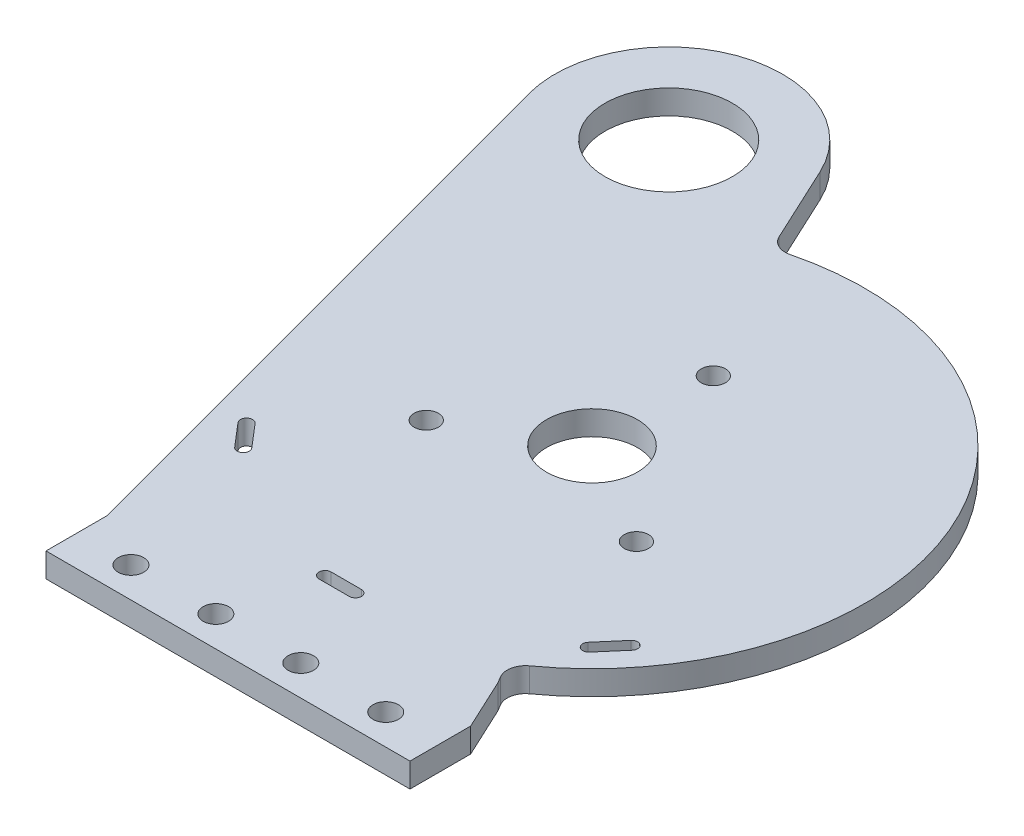
ISO-10303-21;
HEADER;
FILE_DESCRIPTION(('STEP AP214'),'2;1');
FILE_NAME('part.step','',(''),(''),'','','');
FILE_SCHEMA(('AUTOMOTIVE_DESIGN { 1 0 10303 214 1 1 1 1 }'));
ENDSEC;
DATA;
#1=APPLICATION_CONTEXT('core data for automotive mechanical design processes');
#2=APPLICATION_PROTOCOL_DEFINITION('international standard','automotive_design',2000,#1);
#3=PRODUCT_CONTEXT('',#1,'mechanical');
#4=PRODUCT('Part','Part','',(#3));
#5=PRODUCT_RELATED_PRODUCT_CATEGORY('part','',(#4));
#6=PRODUCT_DEFINITION_FORMATION('','',#4);
#7=PRODUCT_DEFINITION_CONTEXT('part definition',#1,'design');
#8=PRODUCT_DEFINITION('design','',#6,#7);
#9=PRODUCT_DEFINITION_SHAPE('','',#8);
#10=(LENGTH_UNIT() NAMED_UNIT(*) SI_UNIT(.MILLI.,.METRE.));
#11=(NAMED_UNIT(*) PLANE_ANGLE_UNIT() SI_UNIT($,.RADIAN.));
#12=(NAMED_UNIT(*) SI_UNIT($,.STERADIAN.) SOLID_ANGLE_UNIT());
#13=UNCERTAINTY_MEASURE_WITH_UNIT(LENGTH_MEASURE(1.E-05),#10,'distance_accuracy_value','');
#14=(GEOMETRIC_REPRESENTATION_CONTEXT(3) GLOBAL_UNCERTAINTY_ASSIGNED_CONTEXT((#13)) GLOBAL_UNIT_ASSIGNED_CONTEXT((#10,
#11,#12)) REPRESENTATION_CONTEXT('',''));
#15=CARTESIAN_POINT('',(0.,0.,0.));
#16=DIRECTION('',(0.,0.,1.));
#17=DIRECTION('',(1.,0.,0.));
#18=AXIS2_PLACEMENT_3D('',#15,#16,#17);
#19=CARTESIAN_POINT('',(-7.35232150739505,4.,-110.));
#20=DIRECTION('',(0.,-1.,0.));
#21=DIRECTION('',(0.,0.,-1.));
#22=AXIS2_PLACEMENT_3D('',#19,#20,#21);
#23=PLANE('',#22);
#24=CARTESIAN_POINT('',(-1.73526570816673,4.,-34.7933954997494));
#25=DIRECTION('',(0.,1.,0.));
#26=DIRECTION('',(0.,0.,1.));
#27=AXIS2_PLACEMENT_3D('',#24,#25,#26);
#28=CIRCLE('',#27,0.999999999999993);
#29=CARTESIAN_POINT('',(-0.975772037280662,4.,-35.4439101912699));
#30=VERTEX_POINT('',#29);
#31=CARTESIAN_POINT('',(-2.4947593790528,4.,-34.1428808082289));
#32=VERTEX_POINT('',#31);
#33=EDGE_CURVE('E226',#30,#32,#28,.T.);
#34=ORIENTED_EDGE('',*,*,#33,.F.);
#35=DIRECTION('',(-0.650514691520488,0.,-0.759493670886074));
#36=VECTOR('',#35,1.);
#37=CARTESIAN_POINT('',(-0.975772037280662,4.,-35.4439101912699));
#38=LINE('',#37,#36);
#39=CARTESIAN_POINT('',(2.27680142032179,4.,-31.6464418368395));
#40=VERTEX_POINT('',#39);
#41=EDGE_CURVE('E234',#40,#30,#38,.T.);
#42=ORIENTED_EDGE('',*,*,#41,.F.);
#43=CARTESIAN_POINT('',(1.51730774943569,4.,-30.995927145319));
#44=DIRECTION('',(0.,1.,0.));
#45=DIRECTION('',(0.,0.,1.));
#46=AXIS2_PLACEMENT_3D('',#43,#44,#45);
#47=CIRCLE('',#46,1.);
#48=CARTESIAN_POINT('',(0.757814078549616,4.,-30.3454124537985));
#49=VERTEX_POINT('',#48);
#50=EDGE_CURVE('E231',#49,#40,#47,.T.);
#51=ORIENTED_EDGE('',*,*,#50,.F.);
#52=DIRECTION('',(0.650514691520485,0.,0.759493670886077));
#53=VECTOR('',#52,1.);
#54=CARTESIAN_POINT('',(-2.4947593790528,4.,-34.1428808082289));
#55=LINE('',#54,#53);
#56=EDGE_CURVE('E228',#32,#49,#55,.T.);
#57=ORIENTED_EDGE('',*,*,#56,.F.);
#58=EDGE_LOOP('',(#34,#42,#51,#57));
#59=FACE_BOUND('',#58,.T.);
#60=CARTESIAN_POINT('',(51.,4.,-5.));
#61=DIRECTION('',(0.,1.,0.));
#62=DIRECTION('',(0.,0.,-1.));
#63=AXIS2_PLACEMENT_3D('',#60,#61,#62);
#64=CIRCLE('',#63,2.1);
#65=CARTESIAN_POINT('',(51.,4.,-7.1));
#66=VERTEX_POINT('',#65);
#67=EDGE_CURVE('E288',#66,#66,#64,.T.);
#68=ORIENTED_EDGE('',*,*,#67,.F.);
#69=EDGE_LOOP('',(#68));
#70=FACE_BOUND('',#69,.T.);
#71=CARTESIAN_POINT('',(37.,4.,-5.));
#72=DIRECTION('',(0.,1.,0.));
#73=DIRECTION('',(0.,0.,-1.));
#74=AXIS2_PLACEMENT_3D('',#71,#72,#73);
#75=CIRCLE('',#74,2.1);
#76=CARTESIAN_POINT('',(37.,4.,-7.1));
#77=VERTEX_POINT('',#76);
#78=EDGE_CURVE('E294',#77,#77,#75,.T.);
#79=ORIENTED_EDGE('',*,*,#78,.F.);
#80=EDGE_LOOP('',(#79));
#81=FACE_BOUND('',#80,.T.);
#82=CARTESIAN_POINT('',(9.,4.,-5.));
#83=DIRECTION('',(0.,1.,0.));
#84=DIRECTION('',(0.,0.,1.));
#85=AXIS2_PLACEMENT_3D('',#82,#83,#84);
#86=CIRCLE('',#85,2.1);
#87=CARTESIAN_POINT('',(9.,4.,-2.9));
#88=VERTEX_POINT('',#87);
#89=EDGE_CURVE('E300',#88,#88,#86,.T.);
#90=ORIENTED_EDGE('',*,*,#89,.F.);
#91=EDGE_LOOP('',(#90));
#92=FACE_BOUND('',#91,.T.);
#93=CARTESIAN_POINT('',(23.,4.,-5.));
#94=DIRECTION('',(0.,1.,0.));
#95=DIRECTION('',(0.,0.,1.));
#96=AXIS2_PLACEMENT_3D('',#93,#94,#95);
#97=CIRCLE('',#96,2.1);
#98=CARTESIAN_POINT('',(23.,4.,-2.9));
#99=VERTEX_POINT('',#98);
#100=EDGE_CURVE('E306',#99,#99,#97,.T.);
#101=ORIENTED_EDGE('',*,*,#100,.F.);
#102=EDGE_LOOP('',(#101));
#103=FACE_BOUND('',#102,.T.);
#104=CARTESIAN_POINT('',(12.6794919243111,4.,-50.0000000000002));
#105=DIRECTION('',(0.,1.,0.));
#106=DIRECTION('',(0.,0.,1.));
#107=AXIS2_PLACEMENT_3D('',#104,#105,#106);
#108=CIRCLE('',#107,2.00000000000001);
#109=CARTESIAN_POINT('',(12.6794919243111,4.,-48.0000000000001));
#110=VERTEX_POINT('',#109);
#111=EDGE_CURVE('E312',#110,#110,#108,.T.);
#112=ORIENTED_EDGE('',*,*,#111,.F.);
#113=EDGE_LOOP('',(#112));
#114=FACE_BOUND('',#113,.T.);
#115=CARTESIAN_POINT('',(47.3205080756887,4.,-49.9999999999999));
#116=DIRECTION('',(0.,1.,0.));
#117=DIRECTION('',(0.,0.,1.));
#118=AXIS2_PLACEMENT_3D('',#115,#116,#117);
#119=CIRCLE('',#118,2.00000000000001);
#120=CARTESIAN_POINT('',(47.3205080756887,4.,-47.9999999999999));
#121=VERTEX_POINT('',#120);
#122=EDGE_CURVE('E318',#121,#121,#119,.T.);
#123=ORIENTED_EDGE('',*,*,#122,.F.);
#124=EDGE_LOOP('',(#123));
#125=FACE_BOUND('',#124,.T.);
#126=CARTESIAN_POINT('',(30.,4.,-80.));
#127=DIRECTION('',(0.,1.,0.));
#128=DIRECTION('',(0.,0.,1.));
#129=AXIS2_PLACEMENT_3D('',#126,#127,#128);
#130=CIRCLE('',#129,2.);
#131=CARTESIAN_POINT('',(30.,4.,-78.));
#132=VERTEX_POINT('',#131);
#133=EDGE_CURVE('E324',#132,#132,#130,.T.);
#134=ORIENTED_EDGE('',*,*,#133,.F.);
#135=EDGE_LOOP('',(#134));
#136=FACE_BOUND('',#135,.T.);
#137=CARTESIAN_POINT('',(30.,4.,-60.));
#138=DIRECTION('',(0.,1.,0.));
#139=DIRECTION('',(0.,0.,1.));
#140=AXIS2_PLACEMENT_3D('',#137,#138,#139);
#141=CIRCLE('',#140,7.5);
#142=CARTESIAN_POINT('',(30.,4.,-52.5));
#143=VERTEX_POINT('',#142);
#144=EDGE_CURVE('E330',#143,#143,#141,.T.);
#145=ORIENTED_EDGE('',*,*,#144,.F.);
#146=EDGE_LOOP('',(#145));
#147=FACE_BOUND('',#146,.T.);
#148=CARTESIAN_POINT('',(-7.35232150739505,4.,-110.));
#149=DIRECTION('',(0.,1.,0.));
#150=DIRECTION('',(0.,0.,1.));
#151=AXIS2_PLACEMENT_3D('',#148,#149,#150);
#152=CIRCLE('',#151,10.5);
#153=CARTESIAN_POINT('',(-7.35232150739505,4.,-99.5));
#154=VERTEX_POINT('',#153);
#155=EDGE_CURVE('E336',#154,#154,#152,.T.);
#156=ORIENTED_EDGE('',*,*,#155,.F.);
#157=EDGE_LOOP('',(#156));
#158=FACE_BOUND('',#157,.T.);
#159=DIRECTION('',(0.258819045102515,0.,0.96592582628907));
#160=VECTOR('',#159,1.);
#161=CARTESIAN_POINT('',(0.,4.,-10.));
#162=LINE('',#161,#160);
#163=CARTESIAN_POINT('',(-25.4925121525996,4.,-105.139350566071));
#164=VERTEX_POINT('',#163);
#165=CARTESIAN_POINT('',(0.,4.,-10.));
#166=VERTEX_POINT('',#165);
#167=EDGE_CURVE('E342',#164,#166,#162,.T.);
#168=ORIENTED_EDGE('',*,*,#167,.T.);
#169=DIRECTION('',(0.,0.,1.));
#170=VECTOR('',#169,1.);
#171=CARTESIAN_POINT('',(0.,4.,-10.));
#172=LINE('',#171,#170);
#173=CARTESIAN_POINT('',(0.,4.,0.));
#174=VERTEX_POINT('',#173);
#175=EDGE_CURVE('E345',#166,#174,#172,.T.);
#176=ORIENTED_EDGE('',*,*,#175,.T.);
#177=DIRECTION('',(1.,0.,0.));
#178=VECTOR('',#177,1.);
#179=CARTESIAN_POINT('',(0.,4.,0.));
#180=LINE('',#179,#178);
#181=CARTESIAN_POINT('',(60.,4.,0.));
#182=VERTEX_POINT('',#181);
#183=EDGE_CURVE('E348',#174,#182,#180,.T.);
#184=ORIENTED_EDGE('',*,*,#183,.T.);
#185=DIRECTION('',(0.,0.,-1.));
#186=VECTOR('',#185,1.);
#187=CARTESIAN_POINT('',(60.,4.,0.));
#188=LINE('',#187,#186);
#189=CARTESIAN_POINT('',(60.,4.,-10.));
#190=VERTEX_POINT('',#189);
#191=EDGE_CURVE('E350',#182,#190,#188,.T.);
#192=ORIENTED_EDGE('',*,*,#191,.T.);
#193=DIRECTION('',(-0.422618261740704,0.,-0.906307787036648));
#194=VECTOR('',#193,1.);
#195=CARTESIAN_POINT('',(56.09518228465,4.,-18.3739086138962));
#196=LINE('',#195,#194);
#197=CARTESIAN_POINT('',(56.09518228465,4.,-18.3739086138962));
#198=VERTEX_POINT('',#197);
#199=EDGE_CURVE('E352',#190,#198,#196,.T.);
#200=ORIENTED_EDGE('',*,*,#199,.T.);
#201=DIRECTION('',(-0.50794355475064,0.,-0.861390355870835));
#202=VECTOR('',#201,1.);
#203=CARTESIAN_POINT('',(55.4311501675812,4.,-19.5));
#204=LINE('',#203,#202);
#205=CARTESIAN_POINT('',(55.4311501675812,4.,-19.5));
#206=VERTEX_POINT('',#205);
#207=EDGE_CURVE('E354',#198,#206,#204,.T.);
#208=ORIENTED_EDGE('',*,*,#207,.T.);
#209=CARTESIAN_POINT('',(58.0153212351937,4.,-21.0238306642519));
#210=DIRECTION('',(0.,-1.,0.));
#211=DIRECTION('',(0.,0.,-1.));
#212=AXIS2_PLACEMENT_3D('',#209,#210,#211);
#213=CIRCLE('',#212,3.);
#214=CARTESIAN_POINT('',(56.264363657994,4.,-23.4598412477362));
#215=VERTEX_POINT('',#214);
#216=EDGE_CURVE('E356',#206,#215,#213,.T.);
#217=ORIENTED_EDGE('',*,*,#216,.T.);
#218=CARTESIAN_POINT('',(30.,4.,-60.));
#219=DIRECTION('',(0.,1.,0.));
#220=DIRECTION('',(0.,0.,-1.));
#221=AXIS2_PLACEMENT_3D('',#218,#219,#220);
#222=CIRCLE('',#221,45.);
#223=CARTESIAN_POINT('',(19.0204171989288,4.,-103.639990393152));
#224=VERTEX_POINT('',#223);
#225=EDGE_CURVE('E358',#215,#224,#222,.T.);
#226=ORIENTED_EDGE('',*,*,#225,.T.);
#227=CARTESIAN_POINT('',(18.2884450121907,4.,-106.549323086029));
#228=DIRECTION('',(0.,-1.,0.));
#229=DIRECTION('',(0.,0.,1.));
#230=AXIS2_PLACEMENT_3D('',#227,#228,#229);
#231=CIRCLE('',#230,3.00000000000001);
#232=CARTESIAN_POINT('',(15.5695216510808,4.,-105.281468300807));
#233=VERTEX_POINT('',#232);
#234=EDGE_CURVE('E360',#224,#233,#231,.T.);
#235=ORIENTED_EDGE('',*,*,#234,.T.);
#236=DIRECTION('',(-0.422618261740701,0.,-0.906307787036649));
#237=VECTOR('',#236,1.);
#238=CARTESIAN_POINT('',(9.66823596464226,4.,-117.936816295278));
#239=LINE('',#238,#237);
#240=CARTESIAN_POINT('',(9.66823596464226,4.,-117.936816295278));
#241=VERTEX_POINT('',#240);
#242=EDGE_CURVE('E362',#233,#241,#239,.T.);
#243=ORIENTED_EDGE('',*,*,#242,.T.);
#244=CARTESIAN_POINT('',(-7.35232150739505,4.,-110.));
#245=DIRECTION('',(0.,1.,0.));
#246=DIRECTION('',(0.,0.,-1.));
#247=AXIS2_PLACEMENT_3D('',#244,#245,#246);
#248=CIRCLE('',#247,18.780107283078);
#249=EDGE_CURVE('E364',#241,#164,#248,.T.);
#250=ORIENTED_EDGE('',*,*,#249,.T.);
#251=EDGE_LOOP('',(#168,#176,#184,#192,#200,#208,#217,#226,#235,#243,#250));
#252=FACE_BOUND('',#251,.T.);
#253=CARTESIAN_POINT('',(26.5,4.,-19.5));
#254=DIRECTION('',(0.,1.,0.));
#255=DIRECTION('',(0.,0.,1.));
#256=AXIS2_PLACEMENT_3D('',#253,#254,#255);
#257=CIRCLE('',#256,1.);
#258=CARTESIAN_POINT('',(26.5,4.,-20.5));
#259=VERTEX_POINT('',#258);
#260=CARTESIAN_POINT('',(26.5,4.,-18.5));
#261=VERTEX_POINT('',#260);
#262=EDGE_CURVE('E257',#259,#261,#257,.T.);
#263=ORIENTED_EDGE('',*,*,#262,.F.);
#264=DIRECTION('',(-1.,0.,0.));
#265=VECTOR('',#264,1.);
#266=CARTESIAN_POINT('',(26.5,4.,-20.5));
#267=LINE('',#266,#265);
#268=CARTESIAN_POINT('',(31.5,4.,-20.5));
#269=VERTEX_POINT('',#268);
#270=EDGE_CURVE('E265',#269,#259,#267,.T.);
#271=ORIENTED_EDGE('',*,*,#270,.F.);
#272=CARTESIAN_POINT('',(31.5,4.,-19.5));
#273=DIRECTION('',(0.,1.,0.));
#274=DIRECTION('',(0.,0.,1.));
#275=AXIS2_PLACEMENT_3D('',#272,#273,#274);
#276=CIRCLE('',#275,1.);
#277=CARTESIAN_POINT('',(31.5,4.,-18.5));
#278=VERTEX_POINT('',#277);
#279=EDGE_CURVE('E262',#278,#269,#276,.T.);
#280=ORIENTED_EDGE('',*,*,#279,.F.);
#281=DIRECTION('',(1.,0.,0.));
#282=VECTOR('',#281,1.);
#283=CARTESIAN_POINT('',(26.5,4.,-18.5));
#284=LINE('',#283,#282);
#285=EDGE_CURVE('E259',#261,#278,#284,.T.);
#286=ORIENTED_EDGE('',*,*,#285,.F.);
#287=EDGE_LOOP('',(#263,#271,#280,#286));
#288=FACE_BOUND('',#287,.T.);
#289=CARTESIAN_POINT('',(61.7352657081667,4.,-34.7933954997494));
#290=DIRECTION('',(0.,1.,0.));
#291=DIRECTION('',(0.,0.,-1.));
#292=AXIS2_PLACEMENT_3D('',#289,#290,#291);
#293=CIRCLE('',#292,0.999999999999994);
#294=CARTESIAN_POINT('',(62.4947593790528,4.,-34.1428808082289));
#295=VERTEX_POINT('',#294);
#296=CARTESIAN_POINT('',(60.9757720372807,4.,-35.4439101912699));
#297=VERTEX_POINT('',#296);
#298=EDGE_CURVE('E190',#295,#297,#293,.T.);
#299=ORIENTED_EDGE('',*,*,#298,.F.);
#300=DIRECTION('',(0.650514691520485,0.,-0.759493670886077));
#301=VECTOR('',#300,1.);
#302=CARTESIAN_POINT('',(62.4947593790528,4.,-34.1428808082289));
#303=LINE('',#302,#301);
#304=CARTESIAN_POINT('',(59.2421859214504,4.,-30.3454124537985));
#305=VERTEX_POINT('',#304);
#306=EDGE_CURVE('E212',#305,#295,#303,.T.);
#307=ORIENTED_EDGE('',*,*,#306,.F.);
#308=CARTESIAN_POINT('',(58.4826922505643,4.,-30.995927145319));
#309=DIRECTION('',(0.,1.,0.));
#310=DIRECTION('',(0.,0.,-1.));
#311=AXIS2_PLACEMENT_3D('',#308,#309,#310);
#312=CIRCLE('',#311,1.);
#313=CARTESIAN_POINT('',(57.7231985796782,4.,-31.6464418368395));
#314=VERTEX_POINT('',#313);
#315=EDGE_CURVE('E210',#314,#305,#312,.T.);
#316=ORIENTED_EDGE('',*,*,#315,.F.);
#317=DIRECTION('',(-0.650514691520487,0.,0.759493670886075));
#318=VECTOR('',#317,1.);
#319=CARTESIAN_POINT('',(60.9757720372807,4.,-35.4439101912699));
#320=LINE('',#319,#318);
#321=EDGE_CURVE('E198',#297,#314,#320,.T.);
#322=ORIENTED_EDGE('',*,*,#321,.F.);
#323=EDGE_LOOP('',(#299,#307,#316,#322));
#324=FACE_BOUND('',#323,.T.);
#325=ADVANCED_FACE('F35',(#59,#70,#81,#92,#103,#114,#125,#136,#147,#158,#252,#288,#324),#23,.F.);
#326=CARTESIAN_POINT('',(-7.35232150739505,0.,-110.));
#327=DIRECTION('',(0.,-1.,0.));
#328=DIRECTION('',(0.,0.,-1.));
#329=AXIS2_PLACEMENT_3D('',#326,#327,#328);
#330=PLANE('',#329);
#331=CARTESIAN_POINT('',(37.,0.,-5.));
#332=DIRECTION('',(0.,1.,0.));
#333=DIRECTION('',(0.,0.,-1.));
#334=AXIS2_PLACEMENT_3D('',#331,#332,#333);
#335=CIRCLE('',#334,2.1);
#336=CARTESIAN_POINT('',(37.,0.,-7.1));
#337=VERTEX_POINT('',#336);
#338=EDGE_CURVE('E291',#337,#337,#335,.T.);
#339=ORIENTED_EDGE('',*,*,#338,.T.);
#340=EDGE_LOOP('',(#339));
#341=FACE_BOUND('',#340,.T.);
#342=CARTESIAN_POINT('',(23.,0.,-5.));
#343=DIRECTION('',(0.,1.,0.));
#344=DIRECTION('',(0.,0.,1.));
#345=AXIS2_PLACEMENT_3D('',#342,#343,#344);
#346=CIRCLE('',#345,2.1);
#347=CARTESIAN_POINT('',(23.,0.,-2.9));
#348=VERTEX_POINT('',#347);
#349=EDGE_CURVE('E303',#348,#348,#346,.T.);
#350=ORIENTED_EDGE('',*,*,#349,.T.);
#351=EDGE_LOOP('',(#350));
#352=FACE_BOUND('',#351,.T.);
#353=CARTESIAN_POINT('',(47.3205080756887,0.,-49.9999999999999));
#354=DIRECTION('',(0.,1.,0.));
#355=DIRECTION('',(0.,0.,1.));
#356=AXIS2_PLACEMENT_3D('',#353,#354,#355);
#357=CIRCLE('',#356,2.00000000000001);
#358=CARTESIAN_POINT('',(47.3205080756887,0.,-47.9999999999999));
#359=VERTEX_POINT('',#358);
#360=EDGE_CURVE('E315',#359,#359,#357,.T.);
#361=ORIENTED_EDGE('',*,*,#360,.T.);
#362=EDGE_LOOP('',(#361));
#363=FACE_BOUND('',#362,.T.);
#364=CARTESIAN_POINT('',(30.,0.,-60.));
#365=DIRECTION('',(0.,1.,0.));
#366=DIRECTION('',(0.,0.,1.));
#367=AXIS2_PLACEMENT_3D('',#364,#365,#366);
#368=CIRCLE('',#367,7.5);
#369=CARTESIAN_POINT('',(30.,0.,-52.5));
#370=VERTEX_POINT('',#369);
#371=EDGE_CURVE('E327',#370,#370,#368,.T.);
#372=ORIENTED_EDGE('',*,*,#371,.T.);
#373=EDGE_LOOP('',(#372));
#374=FACE_BOUND('',#373,.T.);
#375=DIRECTION('',(0.258819045102515,0.,0.96592582628907));
#376=VECTOR('',#375,1.);
#377=CARTESIAN_POINT('',(0.,0.,-10.));
#378=LINE('',#377,#376);
#379=CARTESIAN_POINT('',(-25.4925121525996,0.,-105.139350566071));
#380=VERTEX_POINT('',#379);
#381=CARTESIAN_POINT('',(0.,0.,-10.));
#382=VERTEX_POINT('',#381);
#383=EDGE_CURVE('E339',#380,#382,#378,.T.);
#384=ORIENTED_EDGE('',*,*,#383,.F.);
#385=CARTESIAN_POINT('',(-7.35232150739505,0.,-110.));
#386=DIRECTION('',(0.,1.,0.));
#387=DIRECTION('',(0.,0.,-1.));
#388=AXIS2_PLACEMENT_3D('',#385,#386,#387);
#389=CIRCLE('',#388,18.780107283078);
#390=CARTESIAN_POINT('',(9.66823596464226,0.,-117.936816295278));
#391=VERTEX_POINT('',#390);
#392=EDGE_CURVE('E346',#391,#380,#389,.T.);
#393=ORIENTED_EDGE('',*,*,#392,.F.);
#394=DIRECTION('',(-0.422618261740701,0.,-0.906307787036649));
#395=VECTOR('',#394,1.);
#396=CARTESIAN_POINT('',(9.66823596464226,0.,-117.936816295278));
#397=LINE('',#396,#395);
#398=CARTESIAN_POINT('',(15.5695216510808,0.,-105.281468300807));
#399=VERTEX_POINT('',#398);
#400=EDGE_CURVE('E385',#399,#391,#397,.T.);
#401=ORIENTED_EDGE('',*,*,#400,.F.);
#402=CARTESIAN_POINT('',(18.2884450121907,0.,-106.549323086029));
#403=DIRECTION('',(0.,-1.,0.));
#404=DIRECTION('',(0.,0.,1.));
#405=AXIS2_PLACEMENT_3D('',#402,#403,#404);
#406=CIRCLE('',#405,3.00000000000001);
#407=CARTESIAN_POINT('',(19.0204171989288,0.,-103.639990393152));
#408=VERTEX_POINT('',#407);
#409=EDGE_CURVE('E383',#408,#399,#406,.T.);
#410=ORIENTED_EDGE('',*,*,#409,.F.);
#411=CARTESIAN_POINT('',(30.,0.,-60.));
#412=DIRECTION('',(0.,1.,0.));
#413=DIRECTION('',(0.,0.,-1.));
#414=AXIS2_PLACEMENT_3D('',#411,#412,#413);
#415=CIRCLE('',#414,45.);
#416=CARTESIAN_POINT('',(56.264363657994,0.,-23.4598412477362));
#417=VERTEX_POINT('',#416);
#418=EDGE_CURVE('E381',#417,#408,#415,.T.);
#419=ORIENTED_EDGE('',*,*,#418,.F.);
#420=CARTESIAN_POINT('',(58.0153212351937,0.,-21.0238306642519));
#421=DIRECTION('',(0.,-1.,0.));
#422=DIRECTION('',(0.,0.,-1.));
#423=AXIS2_PLACEMENT_3D('',#420,#421,#422);
#424=CIRCLE('',#423,3.);
#425=CARTESIAN_POINT('',(55.4311501675812,0.,-19.5));
#426=VERTEX_POINT('',#425);
#427=EDGE_CURVE('E379',#426,#417,#424,.T.);
#428=ORIENTED_EDGE('',*,*,#427,.F.);
#429=DIRECTION('',(-0.50794355475064,0.,-0.861390355870835));
#430=VECTOR('',#429,1.);
#431=CARTESIAN_POINT('',(55.4311501675812,0.,-19.5));
#432=LINE('',#431,#430);
#433=CARTESIAN_POINT('',(56.09518228465,0.,-18.3739086138962));
#434=VERTEX_POINT('',#433);
#435=EDGE_CURVE('E377',#434,#426,#432,.T.);
#436=ORIENTED_EDGE('',*,*,#435,.F.);
#437=DIRECTION('',(-0.422618261740704,0.,-0.906307787036648));
#438=VECTOR('',#437,1.);
#439=CARTESIAN_POINT('',(56.09518228465,0.,-18.3739086138962));
#440=LINE('',#439,#438);
#441=CARTESIAN_POINT('',(60.,0.,-10.));
#442=VERTEX_POINT('',#441);
#443=EDGE_CURVE('E375',#442,#434,#440,.T.);
#444=ORIENTED_EDGE('',*,*,#443,.F.);
#445=DIRECTION('',(0.,0.,-1.));
#446=VECTOR('',#445,1.);
#447=CARTESIAN_POINT('',(60.,0.,0.));
#448=LINE('',#447,#446);
#449=CARTESIAN_POINT('',(60.,0.,0.));
#450=VERTEX_POINT('',#449);
#451=EDGE_CURVE('E373',#450,#442,#448,.T.);
#452=ORIENTED_EDGE('',*,*,#451,.F.);
#453=DIRECTION('',(1.,0.,0.));
#454=VECTOR('',#453,1.);
#455=CARTESIAN_POINT('',(0.,0.,0.));
#456=LINE('',#455,#454);
#457=CARTESIAN_POINT('',(0.,0.,0.));
#458=VERTEX_POINT('',#457);
#459=EDGE_CURVE('E371',#458,#450,#456,.T.);
#460=ORIENTED_EDGE('',*,*,#459,.F.);
#461=DIRECTION('',(0.,0.,1.));
#462=VECTOR('',#461,1.);
#463=CARTESIAN_POINT('',(0.,0.,-10.));
#464=LINE('',#463,#462);
#465=EDGE_CURVE('E369',#382,#458,#464,.T.);
#466=ORIENTED_EDGE('',*,*,#465,.F.);
#467=EDGE_LOOP('',(#384,#393,#401,#410,#419,#428,#436,#444,#452,#460,#466));
#468=FACE_BOUND('',#467,.T.);
#469=CARTESIAN_POINT('',(-7.35232150739505,0.,-110.));
#470=DIRECTION('',(0.,1.,0.));
#471=DIRECTION('',(0.,0.,1.));
#472=AXIS2_PLACEMENT_3D('',#469,#470,#471);
#473=CIRCLE('',#472,10.5);
#474=CARTESIAN_POINT('',(-7.35232150739505,0.,-99.5));
#475=VERTEX_POINT('',#474);
#476=EDGE_CURVE('E333',#475,#475,#473,.T.);
#477=ORIENTED_EDGE('',*,*,#476,.T.);
#478=EDGE_LOOP('',(#477));
#479=FACE_BOUND('',#478,.T.);
#480=CARTESIAN_POINT('',(30.,0.,-80.));
#481=DIRECTION('',(0.,1.,0.));
#482=DIRECTION('',(0.,0.,1.));
#483=AXIS2_PLACEMENT_3D('',#480,#481,#482);
#484=CIRCLE('',#483,2.);
#485=CARTESIAN_POINT('',(30.,0.,-78.));
#486=VERTEX_POINT('',#485);
#487=EDGE_CURVE('E321',#486,#486,#484,.T.);
#488=ORIENTED_EDGE('',*,*,#487,.T.);
#489=EDGE_LOOP('',(#488));
#490=FACE_BOUND('',#489,.T.);
#491=CARTESIAN_POINT('',(12.6794919243111,0.,-50.0000000000002));
#492=DIRECTION('',(0.,1.,0.));
#493=DIRECTION('',(0.,0.,1.));
#494=AXIS2_PLACEMENT_3D('',#491,#492,#493);
#495=CIRCLE('',#494,2.00000000000001);
#496=CARTESIAN_POINT('',(12.6794919243111,0.,-48.0000000000001));
#497=VERTEX_POINT('',#496);
#498=EDGE_CURVE('E309',#497,#497,#495,.T.);
#499=ORIENTED_EDGE('',*,*,#498,.T.);
#500=EDGE_LOOP('',(#499));
#501=FACE_BOUND('',#500,.T.);
#502=CARTESIAN_POINT('',(9.,0.,-5.));
#503=DIRECTION('',(0.,1.,0.));
#504=DIRECTION('',(0.,0.,1.));
#505=AXIS2_PLACEMENT_3D('',#502,#503,#504);
#506=CIRCLE('',#505,2.1);
#507=CARTESIAN_POINT('',(9.,0.,-2.9));
#508=VERTEX_POINT('',#507);
#509=EDGE_CURVE('E297',#508,#508,#506,.T.);
#510=ORIENTED_EDGE('',*,*,#509,.T.);
#511=EDGE_LOOP('',(#510));
#512=FACE_BOUND('',#511,.T.);
#513=CARTESIAN_POINT('',(51.,0.,-5.));
#514=DIRECTION('',(0.,1.,0.));
#515=DIRECTION('',(0.,0.,-1.));
#516=AXIS2_PLACEMENT_3D('',#513,#514,#515);
#517=CIRCLE('',#516,2.1);
#518=CARTESIAN_POINT('',(51.,0.,-7.1));
#519=VERTEX_POINT('',#518);
#520=EDGE_CURVE('E287',#519,#519,#517,.T.);
#521=ORIENTED_EDGE('',*,*,#520,.T.);
#522=EDGE_LOOP('',(#521));
#523=FACE_BOUND('',#522,.T.);
#524=DIRECTION('',(-1.,0.,0.));
#525=VECTOR('',#524,1.);
#526=CARTESIAN_POINT('',(26.5,0.,-20.5));
#527=LINE('',#526,#525);
#528=CARTESIAN_POINT('',(31.5,0.,-20.5));
#529=VERTEX_POINT('',#528);
#530=CARTESIAN_POINT('',(26.5,0.,-20.5));
#531=VERTEX_POINT('',#530);
#532=EDGE_CURVE('E260',#529,#531,#527,.T.);
#533=ORIENTED_EDGE('',*,*,#532,.T.);
#534=CARTESIAN_POINT('',(26.5,0.,-19.5));
#535=DIRECTION('',(0.,1.,0.));
#536=DIRECTION('',(0.,0.,1.));
#537=AXIS2_PLACEMENT_3D('',#534,#535,#536);
#538=CIRCLE('',#537,1.);
#539=CARTESIAN_POINT('',(26.5,0.,-18.5));
#540=VERTEX_POINT('',#539);
#541=EDGE_CURVE('E256',#531,#540,#538,.T.);
#542=ORIENTED_EDGE('',*,*,#541,.T.);
#543=DIRECTION('',(1.,0.,0.));
#544=VECTOR('',#543,1.);
#545=CARTESIAN_POINT('',(26.5,0.,-18.5));
#546=LINE('',#545,#544);
#547=CARTESIAN_POINT('',(31.5,0.,-18.5));
#548=VERTEX_POINT('',#547);
#549=EDGE_CURVE('E270',#540,#548,#546,.T.);
#550=ORIENTED_EDGE('',*,*,#549,.T.);
#551=CARTESIAN_POINT('',(31.5,0.,-19.5));
#552=DIRECTION('',(0.,1.,0.));
#553=DIRECTION('',(0.,0.,1.));
#554=AXIS2_PLACEMENT_3D('',#551,#552,#553);
#555=CIRCLE('',#554,1.);
#556=EDGE_CURVE('E273',#548,#529,#555,.T.);
#557=ORIENTED_EDGE('',*,*,#556,.T.);
#558=EDGE_LOOP('',(#533,#542,#550,#557));
#559=FACE_BOUND('',#558,.T.);
#560=DIRECTION('',(-0.650514691520488,0.,-0.759493670886074));
#561=VECTOR('',#560,1.);
#562=CARTESIAN_POINT('',(-0.975772037280662,0.,-35.4439101912699));
#563=LINE('',#562,#561);
#564=CARTESIAN_POINT('',(2.27680142032178,0.,-31.6464418368395));
#565=VERTEX_POINT('',#564);
#566=CARTESIAN_POINT('',(-0.975772037280658,0.,-35.4439101912699));
#567=VERTEX_POINT('',#566);
#568=EDGE_CURVE('E229',#565,#567,#563,.T.);
#569=ORIENTED_EDGE('',*,*,#568,.T.);
#570=CARTESIAN_POINT('',(-1.73526570816673,0.,-34.7933954997494));
#571=DIRECTION('',(0.,1.,0.));
#572=DIRECTION('',(0.,0.,1.));
#573=AXIS2_PLACEMENT_3D('',#570,#571,#572);
#574=CIRCLE('',#573,0.999999999999993);
#575=CARTESIAN_POINT('',(-2.4947593790528,0.,-34.1428808082289));
#576=VERTEX_POINT('',#575);
#577=EDGE_CURVE('E206',#567,#576,#574,.T.);
#578=ORIENTED_EDGE('',*,*,#577,.T.);
#579=DIRECTION('',(0.650514691520485,0.,0.759493670886077));
#580=VECTOR('',#579,1.);
#581=CARTESIAN_POINT('',(-2.4947593790528,0.,-34.1428808082289));
#582=LINE('',#581,#580);
#583=CARTESIAN_POINT('',(0.757814078549616,0.,-30.3454124537985));
#584=VERTEX_POINT('',#583);
#585=EDGE_CURVE('E239',#576,#584,#582,.T.);
#586=ORIENTED_EDGE('',*,*,#585,.T.);
#587=CARTESIAN_POINT('',(1.51730774943569,0.,-30.995927145319));
#588=DIRECTION('',(0.,1.,0.));
#589=DIRECTION('',(0.,0.,1.));
#590=AXIS2_PLACEMENT_3D('',#587,#588,#589);
#591=CIRCLE('',#590,1.);
#592=EDGE_CURVE('E242',#584,#565,#591,.T.);
#593=ORIENTED_EDGE('',*,*,#592,.T.);
#594=EDGE_LOOP('',(#569,#578,#586,#593));
#595=FACE_BOUND('',#594,.T.);
#596=DIRECTION('',(0.650514691520485,0.,-0.759493670886077));
#597=VECTOR('',#596,1.);
#598=CARTESIAN_POINT('',(62.4947593790528,0.,-34.1428808082289));
#599=LINE('',#598,#597);
#600=CARTESIAN_POINT('',(59.2421859214504,0.,-30.3454124537985));
#601=VERTEX_POINT('',#600);
#602=CARTESIAN_POINT('',(62.4947593790528,0.,-34.1428808082289));
#603=VERTEX_POINT('',#602);
#604=EDGE_CURVE('E199',#601,#603,#599,.T.);
#605=ORIENTED_EDGE('',*,*,#604,.T.);
#606=CARTESIAN_POINT('',(61.7352657081667,0.,-34.7933954997494));
#607=DIRECTION('',(0.,1.,0.));
#608=DIRECTION('',(0.,0.,-1.));
#609=AXIS2_PLACEMENT_3D('',#606,#607,#608);
#610=CIRCLE('',#609,0.999999999999994);
#611=CARTESIAN_POINT('',(60.9757720372807,0.,-35.4439101912699));
#612=VERTEX_POINT('',#611);
#613=EDGE_CURVE('E58',#603,#612,#610,.T.);
#614=ORIENTED_EDGE('',*,*,#613,.T.);
#615=DIRECTION('',(-0.650514691520487,0.,0.759493670886075));
#616=VECTOR('',#615,1.);
#617=CARTESIAN_POINT('',(60.9757720372807,0.,-35.4439101912699));
#618=LINE('',#617,#616);
#619=CARTESIAN_POINT('',(57.7231985796782,0.,-31.6464418368395));
#620=VERTEX_POINT('',#619);
#621=EDGE_CURVE('E205',#612,#620,#618,.T.);
#622=ORIENTED_EDGE('',*,*,#621,.T.);
#623=CARTESIAN_POINT('',(58.4826922505643,0.,-30.995927145319));
#624=DIRECTION('',(0.,1.,0.));
#625=DIRECTION('',(0.,0.,-1.));
#626=AXIS2_PLACEMENT_3D('',#623,#624,#625);
#627=CIRCLE('',#626,1.);
#628=EDGE_CURVE('E218',#620,#601,#627,.T.);
#629=ORIENTED_EDGE('',*,*,#628,.T.);
#630=EDGE_LOOP('',(#605,#614,#622,#629));
#631=FACE_BOUND('',#630,.T.);
#632=ADVANCED_FACE('F424',(#341,#352,#363,#374,#468,#479,#490,#501,#512,#523,#559,#595,#631),
#330,.T.);
#633=CARTESIAN_POINT('',(0.,4.,-10.));
#634=DIRECTION('',(0.96592582628907,0.,-0.258819045102515));
#635=DIRECTION('',(-0.258819045102515,0.,-0.96592582628907));
#636=AXIS2_PLACEMENT_3D('',#633,#634,#635);
#637=PLANE('',#636);
#638=ORIENTED_EDGE('',*,*,#383,.T.);
#639=DIRECTION('',(0.,-1.,0.));
#640=VECTOR('',#639,1.);
#641=CARTESIAN_POINT('',(0.,4.,-10.));
#642=LINE('',#641,#640);
#643=EDGE_CURVE('E11',#166,#382,#642,.T.);
#644=ORIENTED_EDGE('',*,*,#643,.F.);
#645=ORIENTED_EDGE('',*,*,#167,.F.);
#646=DIRECTION('',(0.,-1.,0.));
#647=VECTOR('',#646,1.);
#648=CARTESIAN_POINT('',(-25.4925121525996,4.,-105.139350566071));
#649=LINE('',#648,#647);
#650=EDGE_CURVE('E366',#164,#380,#649,.T.);
#651=ORIENTED_EDGE('',*,*,#650,.T.);
#652=EDGE_LOOP('',(#638,#644,#645,#651));
#653=FACE_BOUND('',#652,.T.);
#654=ADVANCED_FACE('F37',(#653),#637,.F.);
#655=CARTESIAN_POINT('',(0.,4.,-10.));
#656=DIRECTION('',(1.,0.,0.));
#657=DIRECTION('',(0.,0.,-1.));
#658=AXIS2_PLACEMENT_3D('',#655,#656,#657);
#659=PLANE('',#658);
#660=ORIENTED_EDGE('',*,*,#465,.T.);
#661=DIRECTION('',(0.,-1.,0.));
#662=VECTOR('',#661,1.);
#663=CARTESIAN_POINT('',(0.,4.,0.));
#664=LINE('',#663,#662);
#665=EDGE_CURVE('E43',#174,#458,#664,.T.);
#666=ORIENTED_EDGE('',*,*,#665,.F.);
#667=ORIENTED_EDGE('',*,*,#175,.F.);
#668=ORIENTED_EDGE('',*,*,#643,.T.);
#669=EDGE_LOOP('',(#660,#666,#667,#668));
#670=FACE_BOUND('',#669,.T.);
#671=ADVANCED_FACE('F442',(#670),#659,.F.);
#672=CARTESIAN_POINT('',(0.,4.,0.));
#673=DIRECTION('',(0.,0.,-1.));
#674=DIRECTION('',(-1.,0.,0.));
#675=AXIS2_PLACEMENT_3D('',#672,#673,#674);
#676=PLANE('',#675);
#677=ORIENTED_EDGE('',*,*,#459,.T.);
#678=DIRECTION('',(0.,-1.,0.));
#679=VECTOR('',#678,1.);
#680=CARTESIAN_POINT('',(60.,4.,0.));
#681=LINE('',#680,#679);
#682=EDGE_CURVE('E411',#182,#450,#681,.T.);
#683=ORIENTED_EDGE('',*,*,#682,.F.);
#684=ORIENTED_EDGE('',*,*,#183,.F.);
#685=ORIENTED_EDGE('',*,*,#665,.T.);
#686=EDGE_LOOP('',(#677,#683,#684,#685));
#687=FACE_BOUND('',#686,.T.);
#688=ADVANCED_FACE('F418',(#687),#676,.F.);
#689=CARTESIAN_POINT('',(60.,4.,0.));
#690=DIRECTION('',(-1.,0.,0.));
#691=DIRECTION('',(0.,0.,1.));
#692=AXIS2_PLACEMENT_3D('',#689,#690,#691);
#693=PLANE('',#692);
#694=ORIENTED_EDGE('',*,*,#451,.T.);
#695=DIRECTION('',(0.,-1.,0.));
#696=VECTOR('',#695,1.);
#697=CARTESIAN_POINT('',(60.,4.,-10.));
#698=LINE('',#697,#696);
#699=EDGE_CURVE('E408',#190,#442,#698,.T.);
#700=ORIENTED_EDGE('',*,*,#699,.F.);
#701=ORIENTED_EDGE('',*,*,#191,.F.);
#702=ORIENTED_EDGE('',*,*,#682,.T.);
#703=EDGE_LOOP('',(#694,#700,#701,#702));
#704=FACE_BOUND('',#703,.T.);
#705=ADVANCED_FACE('F430',(#704),#693,.F.);
#706=CARTESIAN_POINT('',(56.09518228465,4.,-18.3739086138962));
#707=DIRECTION('',(-0.906307787036648,0.,0.422618261740704));
#708=DIRECTION('',(0.422618261740704,0.,0.906307787036648));
#709=AXIS2_PLACEMENT_3D('',#706,#707,#708);
#710=PLANE('',#709);
#711=ORIENTED_EDGE('',*,*,#443,.T.);
#712=DIRECTION('',(0.,-1.,0.));
#713=VECTOR('',#712,1.);
#714=CARTESIAN_POINT('',(56.09518228465,4.,-18.3739086138962));
#715=LINE('',#714,#713);
#716=EDGE_CURVE('E405',#198,#434,#715,.T.);
#717=ORIENTED_EDGE('',*,*,#716,.F.);
#718=ORIENTED_EDGE('',*,*,#199,.F.);
#719=ORIENTED_EDGE('',*,*,#699,.T.);
#720=EDGE_LOOP('',(#711,#717,#718,#719));
#721=FACE_BOUND('',#720,.T.);
#722=ADVANCED_FACE('F434',(#721),#710,.F.);
#723=CARTESIAN_POINT('',(55.4311501675812,4.,-19.5));
#724=DIRECTION('',(-0.861390355870835,0.,0.50794355475064));
#725=DIRECTION('',(0.50794355475064,0.,0.861390355870835));
#726=AXIS2_PLACEMENT_3D('',#723,#724,#725);
#727=PLANE('',#726);
#728=ORIENTED_EDGE('',*,*,#435,.T.);
#729=DIRECTION('',(0.,-1.,0.));
#730=VECTOR('',#729,1.);
#731=CARTESIAN_POINT('',(55.4311501675812,4.,-19.5));
#732=LINE('',#731,#730);
#733=EDGE_CURVE('E402',#206,#426,#732,.T.);
#734=ORIENTED_EDGE('',*,*,#733,.F.);
#735=ORIENTED_EDGE('',*,*,#207,.F.);
#736=ORIENTED_EDGE('',*,*,#716,.T.);
#737=EDGE_LOOP('',(#728,#734,#735,#736));
#738=FACE_BOUND('',#737,.T.);
#739=ADVANCED_FACE('F470',(#738),#727,.F.);
#740=CARTESIAN_POINT('',(58.0153212351937,4.,-21.0238306642519));
#741=DIRECTION('',(0.,-1.,0.));
#742=DIRECTION('',(0.,0.,-1.));
#743=AXIS2_PLACEMENT_3D('',#740,#741,#742);
#744=CYLINDRICAL_SURFACE('',#743,3.);
#745=ORIENTED_EDGE('',*,*,#427,.T.);
#746=DIRECTION('',(0.,-1.,0.));
#747=VECTOR('',#746,1.);
#748=CARTESIAN_POINT('',(56.264363657994,4.,-23.4598412477362));
#749=LINE('',#748,#747);
#750=EDGE_CURVE('E399',#215,#417,#749,.T.);
#751=ORIENTED_EDGE('',*,*,#750,.F.);
#752=ORIENTED_EDGE('',*,*,#216,.F.);
#753=ORIENTED_EDGE('',*,*,#733,.T.);
#754=EDGE_LOOP('',(#745,#751,#752,#753));
#755=FACE_BOUND('',#754,.T.);
#756=ADVANCED_FACE('F468',(#755),#744,.F.);
#757=CARTESIAN_POINT('',(30.,4.,-60.));
#758=DIRECTION('',(0.,-1.,0.));
#759=DIRECTION('',(0.,0.,-1.));
#760=AXIS2_PLACEMENT_3D('',#757,#758,#759);
#761=CYLINDRICAL_SURFACE('',#760,45.);
#762=ORIENTED_EDGE('',*,*,#418,.T.);
#763=DIRECTION('',(0.,-1.,0.));
#764=VECTOR('',#763,1.);
#765=CARTESIAN_POINT('',(19.0204171989288,4.,-103.639990393152));
#766=LINE('',#765,#764);
#767=EDGE_CURVE('E396',#224,#408,#766,.T.);
#768=ORIENTED_EDGE('',*,*,#767,.F.);
#769=ORIENTED_EDGE('',*,*,#225,.F.);
#770=ORIENTED_EDGE('',*,*,#750,.T.);
#771=EDGE_LOOP('',(#762,#768,#769,#770));
#772=FACE_BOUND('',#771,.T.);
#773=ADVANCED_FACE('F463',(#772),#761,.T.);
#774=CARTESIAN_POINT('',(18.2884450121907,4.,-106.549323086029));
#775=DIRECTION('',(0.,-1.,0.));
#776=DIRECTION('',(0.,0.,-1.));
#777=AXIS2_PLACEMENT_3D('',#774,#775,#776);
#778=CYLINDRICAL_SURFACE('',#777,3.00000000000001);
#779=ORIENTED_EDGE('',*,*,#409,.T.);
#780=DIRECTION('',(0.,-1.,0.));
#781=VECTOR('',#780,1.);
#782=CARTESIAN_POINT('',(15.5695216510808,4.,-105.281468300807));
#783=LINE('',#782,#781);
#784=EDGE_CURVE('E393',#233,#399,#783,.T.);
#785=ORIENTED_EDGE('',*,*,#784,.F.);
#786=ORIENTED_EDGE('',*,*,#234,.F.);
#787=ORIENTED_EDGE('',*,*,#767,.T.);
#788=EDGE_LOOP('',(#779,#785,#786,#787));
#789=FACE_BOUND('',#788,.T.);
#790=ADVANCED_FACE('F458',(#789),#778,.F.);
#791=CARTESIAN_POINT('',(9.66823596464226,4.,-117.936816295278));
#792=DIRECTION('',(-0.906307787036649,0.,0.422618261740701));
#793=DIRECTION('',(0.422618261740701,0.,0.906307787036649));
#794=AXIS2_PLACEMENT_3D('',#791,#792,#793);
#795=PLANE('',#794);
#796=ORIENTED_EDGE('',*,*,#400,.T.);
#797=DIRECTION('',(0.,-1.,0.));
#798=VECTOR('',#797,1.);
#799=CARTESIAN_POINT('',(9.66823596464226,4.,-117.936816295278));
#800=LINE('',#799,#798);
#801=EDGE_CURVE('E390',#241,#391,#800,.T.);
#802=ORIENTED_EDGE('',*,*,#801,.F.);
#803=ORIENTED_EDGE('',*,*,#242,.F.);
#804=ORIENTED_EDGE('',*,*,#784,.T.);
#805=EDGE_LOOP('',(#796,#802,#803,#804));
#806=FACE_BOUND('',#805,.T.);
#807=ADVANCED_FACE('F454',(#806),#795,.F.);
#808=CARTESIAN_POINT('',(-7.35232150739505,4.,-110.));
#809=DIRECTION('',(0.,-1.,0.));
#810=DIRECTION('',(0.,0.,-1.));
#811=AXIS2_PLACEMENT_3D('',#808,#809,#810);
#812=CYLINDRICAL_SURFACE('',#811,18.780107283078);
#813=ORIENTED_EDGE('',*,*,#392,.T.);
#814=ORIENTED_EDGE('',*,*,#650,.F.);
#815=ORIENTED_EDGE('',*,*,#249,.F.);
#816=ORIENTED_EDGE('',*,*,#801,.T.);
#817=EDGE_LOOP('',(#813,#814,#815,#816));
#818=FACE_BOUND('',#817,.T.);
#819=ADVANCED_FACE('F449',(#818),#812,.T.);
#820=CARTESIAN_POINT('',(-7.35232150739505,4.,-110.));
#821=DIRECTION('',(0.,-1.,0.));
#822=DIRECTION('',(0.,0.,-1.));
#823=AXIS2_PLACEMENT_3D('',#820,#821,#822);
#824=CYLINDRICAL_SURFACE('',#823,10.5);
#825=ORIENTED_EDGE('',*,*,#155,.T.);
#826=EDGE_LOOP('',(#825));
#827=FACE_BOUND('',#826,.T.);
#828=ORIENTED_EDGE('',*,*,#476,.F.);
#829=EDGE_LOOP('',(#828));
#830=FACE_BOUND('',#829,.T.);
#831=ADVANCED_FACE('F490',(#827,#830),#824,.F.);
#832=CARTESIAN_POINT('',(30.,4.,-60.));
#833=DIRECTION('',(0.,-1.,0.));
#834=DIRECTION('',(0.,0.,-1.));
#835=AXIS2_PLACEMENT_3D('',#832,#833,#834);
#836=CYLINDRICAL_SURFACE('',#835,7.5);
#837=ORIENTED_EDGE('',*,*,#144,.T.);
#838=EDGE_LOOP('',(#837));
#839=FACE_BOUND('',#838,.T.);
#840=ORIENTED_EDGE('',*,*,#371,.F.);
#841=EDGE_LOOP('',(#840));
#842=FACE_BOUND('',#841,.T.);
#843=ADVANCED_FACE('F522',(#839,#842),#836,.F.);
#844=CARTESIAN_POINT('',(30.,4.,-80.));
#845=DIRECTION('',(0.,-1.,0.));
#846=DIRECTION('',(0.,0.,-1.));
#847=AXIS2_PLACEMENT_3D('',#844,#845,#846);
#848=CYLINDRICAL_SURFACE('',#847,2.);
#849=ORIENTED_EDGE('',*,*,#133,.T.);
#850=EDGE_LOOP('',(#849));
#851=FACE_BOUND('',#850,.T.);
#852=ORIENTED_EDGE('',*,*,#487,.F.);
#853=EDGE_LOOP('',(#852));
#854=FACE_BOUND('',#853,.T.);
#855=ADVANCED_FACE('F529',(#851,#854),#848,.F.);
#856=CARTESIAN_POINT('',(47.3205080756887,4.,-49.9999999999999));
#857=DIRECTION('',(0.,-1.,0.));
#858=DIRECTION('',(0.,0.,-1.));
#859=AXIS2_PLACEMENT_3D('',#856,#857,#858);
#860=CYLINDRICAL_SURFACE('',#859,2.00000000000001);
#861=ORIENTED_EDGE('',*,*,#122,.T.);
#862=EDGE_LOOP('',(#861));
#863=FACE_BOUND('',#862,.T.);
#864=ORIENTED_EDGE('',*,*,#360,.F.);
#865=EDGE_LOOP('',(#864));
#866=FACE_BOUND('',#865,.T.);
#867=ADVANCED_FACE('F536',(#863,#866),#860,.F.);
#868=CARTESIAN_POINT('',(12.6794919243111,4.,-50.0000000000002));
#869=DIRECTION('',(0.,-1.,0.));
#870=DIRECTION('',(0.,0.,-1.));
#871=AXIS2_PLACEMENT_3D('',#868,#869,#870);
#872=CYLINDRICAL_SURFACE('',#871,2.00000000000001);
#873=ORIENTED_EDGE('',*,*,#111,.T.);
#874=EDGE_LOOP('',(#873));
#875=FACE_BOUND('',#874,.T.);
#876=ORIENTED_EDGE('',*,*,#498,.F.);
#877=EDGE_LOOP('',(#876));
#878=FACE_BOUND('',#877,.T.);
#879=ADVANCED_FACE('F544',(#875,#878),#872,.F.);
#880=CARTESIAN_POINT('',(23.,4.,-5.));
#881=DIRECTION('',(0.,-1.,0.));
#882=DIRECTION('',(0.,0.,-1.));
#883=AXIS2_PLACEMENT_3D('',#880,#881,#882);
#884=CYLINDRICAL_SURFACE('',#883,2.1);
#885=ORIENTED_EDGE('',*,*,#100,.T.);
#886=EDGE_LOOP('',(#885));
#887=FACE_BOUND('',#886,.T.);
#888=ORIENTED_EDGE('',*,*,#349,.F.);
#889=EDGE_LOOP('',(#888));
#890=FACE_BOUND('',#889,.T.);
#891=ADVANCED_FACE('F552',(#887,#890),#884,.F.);
#892=CARTESIAN_POINT('',(9.,4.,-5.));
#893=DIRECTION('',(0.,-1.,0.));
#894=DIRECTION('',(0.,0.,-1.));
#895=AXIS2_PLACEMENT_3D('',#892,#893,#894);
#896=CYLINDRICAL_SURFACE('',#895,2.1);
#897=ORIENTED_EDGE('',*,*,#89,.T.);
#898=EDGE_LOOP('',(#897));
#899=FACE_BOUND('',#898,.T.);
#900=ORIENTED_EDGE('',*,*,#509,.F.);
#901=EDGE_LOOP('',(#900));
#902=FACE_BOUND('',#901,.T.);
#903=ADVANCED_FACE('F560',(#899,#902),#896,.F.);
#904=CARTESIAN_POINT('',(37.,4.,-5.));
#905=DIRECTION('',(0.,-1.,0.));
#906=DIRECTION('',(0.,0.,-1.));
#907=AXIS2_PLACEMENT_3D('',#904,#905,#906);
#908=CYLINDRICAL_SURFACE('',#907,2.1);
#909=ORIENTED_EDGE('',*,*,#78,.T.);
#910=EDGE_LOOP('',(#909));
#911=FACE_BOUND('',#910,.T.);
#912=ORIENTED_EDGE('',*,*,#338,.F.);
#913=EDGE_LOOP('',(#912));
#914=FACE_BOUND('',#913,.T.);
#915=ADVANCED_FACE('F568',(#911,#914),#908,.F.);
#916=CARTESIAN_POINT('',(51.,4.,-5.));
#917=DIRECTION('',(0.,-1.,0.));
#918=DIRECTION('',(0.,0.,-1.));
#919=AXIS2_PLACEMENT_3D('',#916,#917,#918);
#920=CYLINDRICAL_SURFACE('',#919,2.1);
#921=ORIENTED_EDGE('',*,*,#67,.T.);
#922=EDGE_LOOP('',(#921));
#923=FACE_BOUND('',#922,.T.);
#924=ORIENTED_EDGE('',*,*,#520,.F.);
#925=EDGE_LOOP('',(#924));
#926=FACE_BOUND('',#925,.T.);
#927=ADVANCED_FACE('F576',(#923,#926),#920,.F.);
#928=CARTESIAN_POINT('',(26.5,4.,-19.5));
#929=DIRECTION('',(0.,-1.,0.));
#930=DIRECTION('',(0.,0.,-1.));
#931=AXIS2_PLACEMENT_3D('',#928,#929,#930);
#932=CYLINDRICAL_SURFACE('',#931,1.);
#933=ORIENTED_EDGE('',*,*,#541,.F.);
#934=DIRECTION('',(0.,-1.,0.));
#935=VECTOR('',#934,1.);
#936=CARTESIAN_POINT('',(26.5,4.,-20.5));
#937=LINE('',#936,#935);
#938=EDGE_CURVE('E267',#259,#531,#937,.T.);
#939=ORIENTED_EDGE('',*,*,#938,.F.);
#940=ORIENTED_EDGE('',*,*,#262,.T.);
#941=DIRECTION('',(0.,-1.,0.));
#942=VECTOR('',#941,1.);
#943=CARTESIAN_POINT('',(26.5,4.,-18.5));
#944=LINE('',#943,#942);
#945=EDGE_CURVE('E284',#261,#540,#944,.T.);
#946=ORIENTED_EDGE('',*,*,#945,.T.);
#947=EDGE_LOOP('',(#933,#939,#940,#946));
#948=FACE_BOUND('',#947,.T.);
#949=ADVANCED_FACE('F584',(#948),#932,.F.);
#950=CARTESIAN_POINT('',(26.5,4.,-18.5));
#951=DIRECTION('',(0.,0.,-1.));
#952=DIRECTION('',(-1.,0.,0.));
#953=AXIS2_PLACEMENT_3D('',#950,#951,#952);
#954=PLANE('',#953);
#955=ORIENTED_EDGE('',*,*,#549,.F.);
#956=ORIENTED_EDGE('',*,*,#945,.F.);
#957=ORIENTED_EDGE('',*,*,#285,.T.);
#958=DIRECTION('',(0.,-1.,0.));
#959=VECTOR('',#958,1.);
#960=CARTESIAN_POINT('',(31.5,4.,-18.5));
#961=LINE('',#960,#959);
#962=EDGE_CURVE('E282',#278,#548,#961,.T.);
#963=ORIENTED_EDGE('',*,*,#962,.T.);
#964=EDGE_LOOP('',(#955,#956,#957,#963));
#965=FACE_BOUND('',#964,.T.);
#966=ADVANCED_FACE('F592',(#965),#954,.T.);
#967=CARTESIAN_POINT('',(31.5,4.,-19.5));
#968=DIRECTION('',(0.,-1.,0.));
#969=DIRECTION('',(0.,0.,-1.));
#970=AXIS2_PLACEMENT_3D('',#967,#968,#969);
#971=CYLINDRICAL_SURFACE('',#970,1.);
#972=ORIENTED_EDGE('',*,*,#556,.F.);
#973=ORIENTED_EDGE('',*,*,#962,.F.);
#974=ORIENTED_EDGE('',*,*,#279,.T.);
#975=DIRECTION('',(0.,-1.,0.));
#976=VECTOR('',#975,1.);
#977=CARTESIAN_POINT('',(31.5,4.,-20.5));
#978=LINE('',#977,#976);
#979=EDGE_CURVE('E280',#269,#529,#978,.T.);
#980=ORIENTED_EDGE('',*,*,#979,.T.);
#981=EDGE_LOOP('',(#972,#973,#974,#980));
#982=FACE_BOUND('',#981,.T.);
#983=ADVANCED_FACE('F600',(#982),#971,.F.);
#984=CARTESIAN_POINT('',(26.5,4.,-20.5));
#985=DIRECTION('',(0.,0.,1.));
#986=DIRECTION('',(1.,0.,0.));
#987=AXIS2_PLACEMENT_3D('',#984,#985,#986);
#988=PLANE('',#987);
#989=ORIENTED_EDGE('',*,*,#532,.F.);
#990=ORIENTED_EDGE('',*,*,#979,.F.);
#991=ORIENTED_EDGE('',*,*,#270,.T.);
#992=ORIENTED_EDGE('',*,*,#938,.T.);
#993=EDGE_LOOP('',(#989,#990,#991,#992));
#994=FACE_BOUND('',#993,.T.);
#995=ADVANCED_FACE('F608',(#994),#988,.T.);
#996=CARTESIAN_POINT('',(-1.73526570816673,4.,-34.7933954997494));
#997=DIRECTION('',(0.,-1.,0.));
#998=DIRECTION('',(0.,0.,-1.));
#999=AXIS2_PLACEMENT_3D('',#996,#997,#998);
#1000=CYLINDRICAL_SURFACE('',#999,0.999999999999993);
#1001=ORIENTED_EDGE('',*,*,#577,.F.);
#1002=DIRECTION('',(0.,-1.,0.));
#1003=VECTOR('',#1002,1.);
#1004=CARTESIAN_POINT('',(-0.975772037280662,4.,-35.4439101912699));
#1005=LINE('',#1004,#1003);
#1006=EDGE_CURVE('E236',#30,#567,#1005,.T.);
#1007=ORIENTED_EDGE('',*,*,#1006,.F.);
#1008=ORIENTED_EDGE('',*,*,#33,.T.);
#1009=DIRECTION('',(0.,-1.,0.));
#1010=VECTOR('',#1009,1.);
#1011=CARTESIAN_POINT('',(-2.4947593790528,4.,-34.1428808082289));
#1012=LINE('',#1011,#1010);
#1013=EDGE_CURVE('E253',#32,#576,#1012,.T.);
#1014=ORIENTED_EDGE('',*,*,#1013,.T.);
#1015=EDGE_LOOP('',(#1001,#1007,#1008,#1014));
#1016=FACE_BOUND('',#1015,.T.);
#1017=ADVANCED_FACE('F616',(#1016),#1000,.F.);
#1018=CARTESIAN_POINT('',(-2.4947593790528,4.,-34.1428808082289));
#1019=DIRECTION('',(0.759493670886077,0.,-0.650514691520485));
#1020=DIRECTION('',(-0.650514691520485,0.,-0.759493670886077));
#1021=AXIS2_PLACEMENT_3D('',#1018,#1019,#1020);
#1022=PLANE('',#1021);
#1023=ORIENTED_EDGE('',*,*,#585,.F.);
#1024=ORIENTED_EDGE('',*,*,#1013,.F.);
#1025=ORIENTED_EDGE('',*,*,#56,.T.);
#1026=DIRECTION('',(0.,-1.,0.));
#1027=VECTOR('',#1026,1.);
#1028=CARTESIAN_POINT('',(0.757814078549616,4.,-30.3454124537985));
#1029=LINE('',#1028,#1027);
#1030=EDGE_CURVE('E251',#49,#584,#1029,.T.);
#1031=ORIENTED_EDGE('',*,*,#1030,.T.);
#1032=EDGE_LOOP('',(#1023,#1024,#1025,#1031));
#1033=FACE_BOUND('',#1032,.T.);
#1034=ADVANCED_FACE('F624',(#1033),#1022,.T.);
#1035=CARTESIAN_POINT('',(1.51730774943569,4.,-30.995927145319));
#1036=DIRECTION('',(0.,-1.,0.));
#1037=DIRECTION('',(0.,0.,-1.));
#1038=AXIS2_PLACEMENT_3D('',#1035,#1036,#1037);
#1039=CYLINDRICAL_SURFACE('',#1038,1.);
#1040=ORIENTED_EDGE('',*,*,#592,.F.);
#1041=ORIENTED_EDGE('',*,*,#1030,.F.);
#1042=ORIENTED_EDGE('',*,*,#50,.T.);
#1043=DIRECTION('',(0.,-1.,0.));
#1044=VECTOR('',#1043,1.);
#1045=CARTESIAN_POINT('',(2.27680142032178,4.,-31.6464418368395));
#1046=LINE('',#1045,#1044);
#1047=EDGE_CURVE('E249',#40,#565,#1046,.T.);
#1048=ORIENTED_EDGE('',*,*,#1047,.T.);
#1049=EDGE_LOOP('',(#1040,#1041,#1042,#1048));
#1050=FACE_BOUND('',#1049,.T.);
#1051=ADVANCED_FACE('F632',(#1050),#1039,.F.);
#1052=CARTESIAN_POINT('',(-0.975772037280662,4.,-35.4439101912699));
#1053=DIRECTION('',(-0.759493670886074,0.,0.650514691520488));
#1054=DIRECTION('',(0.650514691520488,0.,0.759493670886074));
#1055=AXIS2_PLACEMENT_3D('',#1052,#1053,#1054);
#1056=PLANE('',#1055);
#1057=ORIENTED_EDGE('',*,*,#568,.F.);
#1058=ORIENTED_EDGE('',*,*,#1047,.F.);
#1059=ORIENTED_EDGE('',*,*,#41,.T.);
#1060=ORIENTED_EDGE('',*,*,#1006,.T.);
#1061=EDGE_LOOP('',(#1057,#1058,#1059,#1060));
#1062=FACE_BOUND('',#1061,.T.);
#1063=ADVANCED_FACE('F640',(#1062),#1056,.T.);
#1064=CARTESIAN_POINT('',(61.7352657081667,4.,-34.7933954997494));
#1065=DIRECTION('',(0.,-1.,0.));
#1066=DIRECTION('',(0.,0.,-1.));
#1067=AXIS2_PLACEMENT_3D('',#1064,#1065,#1066);
#1068=CYLINDRICAL_SURFACE('',#1067,0.999999999999994);
#1069=ORIENTED_EDGE('',*,*,#613,.F.);
#1070=DIRECTION('',(0.,-1.,0.));
#1071=VECTOR('',#1070,1.);
#1072=CARTESIAN_POINT('',(62.4947593790528,4.,-34.1428808082289));
#1073=LINE('',#1072,#1071);
#1074=EDGE_CURVE('E194',#295,#603,#1073,.T.);
#1075=ORIENTED_EDGE('',*,*,#1074,.F.);
#1076=ORIENTED_EDGE('',*,*,#298,.T.);
#1077=DIRECTION('',(0.,-1.,0.));
#1078=VECTOR('',#1077,1.);
#1079=CARTESIAN_POINT('',(60.9757720372807,4.,-35.4439101912699));
#1080=LINE('',#1079,#1078);
#1081=EDGE_CURVE('E193',#297,#612,#1080,.T.);
#1082=ORIENTED_EDGE('',*,*,#1081,.T.);
#1083=EDGE_LOOP('',(#1069,#1075,#1076,#1082));
#1084=FACE_BOUND('',#1083,.T.);
#1085=ADVANCED_FACE('F192',(#1084),#1068,.F.);
#1086=CARTESIAN_POINT('',(60.9757720372807,4.,-35.4439101912699));
#1087=DIRECTION('',(0.759493670886075,0.,0.650514691520487));
#1088=DIRECTION('',(0.650514691520488,0.,-0.759493670886075));
#1089=AXIS2_PLACEMENT_3D('',#1086,#1087,#1088);
#1090=PLANE('',#1089);
#1091=ORIENTED_EDGE('',*,*,#621,.F.);
#1092=ORIENTED_EDGE('',*,*,#1081,.F.);
#1093=ORIENTED_EDGE('',*,*,#321,.T.);
#1094=DIRECTION('',(0.,-1.,0.));
#1095=VECTOR('',#1094,1.);
#1096=CARTESIAN_POINT('',(57.7231985796782,4.,-31.6464418368395));
#1097=LINE('',#1096,#1095);
#1098=EDGE_CURVE('E207',#314,#620,#1097,.T.);
#1099=ORIENTED_EDGE('',*,*,#1098,.T.);
#1100=EDGE_LOOP('',(#1091,#1092,#1093,#1099));
#1101=FACE_BOUND('',#1100,.T.);
#1102=ADVANCED_FACE('F202',(#1101),#1090,.T.);
#1103=CARTESIAN_POINT('',(58.4826922505643,4.,-30.995927145319));
#1104=DIRECTION('',(0.,-1.,0.));
#1105=DIRECTION('',(0.,0.,-1.));
#1106=AXIS2_PLACEMENT_3D('',#1103,#1104,#1105);
#1107=CYLINDRICAL_SURFACE('',#1106,1.);
#1108=ORIENTED_EDGE('',*,*,#628,.F.);
#1109=ORIENTED_EDGE('',*,*,#1098,.F.);
#1110=ORIENTED_EDGE('',*,*,#315,.T.);
#1111=DIRECTION('',(0.,-1.,0.));
#1112=VECTOR('',#1111,1.);
#1113=CARTESIAN_POINT('',(59.2421859214504,4.,-30.3454124537985));
#1114=LINE('',#1113,#1112);
#1115=EDGE_CURVE('E50',#305,#601,#1114,.T.);
#1116=ORIENTED_EDGE('',*,*,#1115,.T.);
#1117=EDGE_LOOP('',(#1108,#1109,#1110,#1116));
#1118=FACE_BOUND('',#1117,.T.);
#1119=ADVANCED_FACE('F661',(#1118),#1107,.F.);
#1120=CARTESIAN_POINT('',(62.4947593790528,4.,-34.1428808082289));
#1121=DIRECTION('',(-0.759493670886077,0.,-0.650514691520485));
#1122=DIRECTION('',(-0.650514691520485,0.,0.759493670886077));
#1123=AXIS2_PLACEMENT_3D('',#1120,#1121,#1122);
#1124=PLANE('',#1123);
#1125=ORIENTED_EDGE('',*,*,#604,.F.);
#1126=ORIENTED_EDGE('',*,*,#1115,.F.);
#1127=ORIENTED_EDGE('',*,*,#306,.T.);
#1128=ORIENTED_EDGE('',*,*,#1074,.T.);
#1129=EDGE_LOOP('',(#1125,#1126,#1127,#1128));
#1130=FACE_BOUND('',#1129,.T.);
#1131=ADVANCED_FACE('F668',(#1130),#1124,.T.);
#1132=CLOSED_SHELL('',(#325,#632,#654,#671,#688,#705,#722,#739,#756,#773,#790,#807,#819,#831,
#843,#855,#867,#879,#891,#903,#915,#927,#949,#966,#983,#995,#1017,#1034,#1051,#1063,#1085,#1102,
#1119,#1131));
#1133=MANIFOLD_SOLID_BREP('B2',#1132);
#1134=ADVANCED_BREP_SHAPE_REPRESENTATION('',(#18,#1133),#14);
#1135=SHAPE_DEFINITION_REPRESENTATION(#9,#1134);
ENDSEC;
END-ISO-10303-21;
